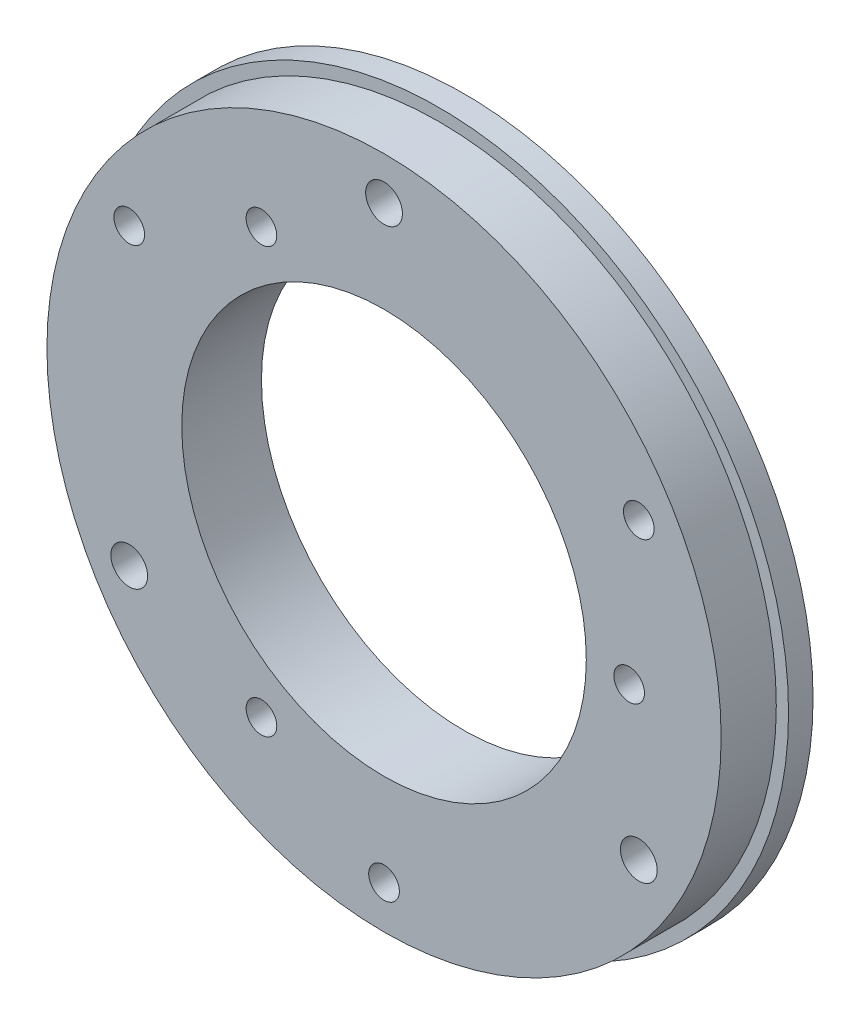
ISO-10303-21;
HEADER;
FILE_DESCRIPTION(('STEP AP214'),'2;1');
FILE_NAME('part.step','',(''),(''),'','','');
FILE_SCHEMA(('AUTOMOTIVE_DESIGN { 1 0 10303 214 1 1 1 1 }'));
ENDSEC;
DATA;
#1=APPLICATION_CONTEXT('core data for automotive mechanical design processes');
#2=APPLICATION_PROTOCOL_DEFINITION('international standard','automotive_design',2000,#1);
#3=PRODUCT_CONTEXT('',#1,'mechanical');
#4=PRODUCT('Part','Part','',(#3));
#5=PRODUCT_RELATED_PRODUCT_CATEGORY('part','',(#4));
#6=PRODUCT_DEFINITION_FORMATION('','',#4);
#7=PRODUCT_DEFINITION_CONTEXT('part definition',#1,'design');
#8=PRODUCT_DEFINITION('design','',#6,#7);
#9=PRODUCT_DEFINITION_SHAPE('','',#8);
#10=(LENGTH_UNIT() NAMED_UNIT(*) SI_UNIT(.MILLI.,.METRE.));
#11=(NAMED_UNIT(*) PLANE_ANGLE_UNIT() SI_UNIT($,.RADIAN.));
#12=(NAMED_UNIT(*) SI_UNIT($,.STERADIAN.) SOLID_ANGLE_UNIT());
#13=UNCERTAINTY_MEASURE_WITH_UNIT(LENGTH_MEASURE(1.E-05),#10,'distance_accuracy_value','');
#14=(GEOMETRIC_REPRESENTATION_CONTEXT(3) GLOBAL_UNCERTAINTY_ASSIGNED_CONTEXT((#13)) GLOBAL_UNIT_ASSIGNED_CONTEXT((#10,
#11,#12)) REPRESENTATION_CONTEXT('',''));
#15=CARTESIAN_POINT('',(0.,0.,0.));
#16=DIRECTION('',(0.,0.,1.));
#17=DIRECTION('',(1.,0.,0.));
#18=AXIS2_PLACEMENT_3D('',#15,#16,#17);
#19=CARTESIAN_POINT('',(0.,0.,2.));
#20=DIRECTION('',(0.,0.,1.));
#21=DIRECTION('',(1.,0.,0.));
#22=AXIS2_PLACEMENT_3D('',#19,#20,#21);
#23=PLANE('',#22);
#24=CARTESIAN_POINT('',(0.,0.,2.));
#25=DIRECTION('',(0.,0.,1.));
#26=DIRECTION('',(1.,0.,0.));
#27=AXIS2_PLACEMENT_3D('',#24,#25,#26);
#28=CIRCLE('',#27,27.5);
#29=CARTESIAN_POINT('',(27.5,0.,2.));
#30=VERTEX_POINT('',#29);
#31=EDGE_CURVE('E10',#30,#30,#28,.T.);
#32=ORIENTED_EDGE('',*,*,#31,.F.);
#33=EDGE_LOOP('',(#32));
#34=FACE_BOUND('',#33,.T.);
#35=CARTESIAN_POINT('',(0.,0.,2.));
#36=DIRECTION('',(0.,0.,1.));
#37=DIRECTION('',(1.,0.,0.));
#38=AXIS2_PLACEMENT_3D('',#35,#36,#37);
#39=CIRCLE('',#38,28.5);
#40=CARTESIAN_POINT('',(28.5,0.,2.));
#41=VERTEX_POINT('',#40);
#42=EDGE_CURVE('E42',#41,#41,#39,.T.);
#43=ORIENTED_EDGE('',*,*,#42,.T.);
#44=EDGE_LOOP('',(#43));
#45=FACE_BOUND('',#44,.T.);
#46=ADVANCED_FACE('F34',(#34,#45),#23,.T.);
#47=CARTESIAN_POINT('',(0.,0.,0.));
#48=DIRECTION('',(0.,0.,1.));
#49=DIRECTION('',(1.,0.,0.));
#50=AXIS2_PLACEMENT_3D('',#47,#48,#49);
#51=PLANE('',#50);
#52=CARTESIAN_POINT('',(-20.7846096908265,-12.0000000000001,0.));
#53=DIRECTION('',(0.,0.,-1.));
#54=DIRECTION('',(0.500000000000004,-0.866025403784436,0.));
#55=AXIS2_PLACEMENT_3D('',#52,#53,#54);
#56=CIRCLE('',#55,3.);
#57=CARTESIAN_POINT('',(-19.2846096908265,-14.5980762113534,0.));
#58=VERTEX_POINT('',#57);
#59=EDGE_CURVE('E326',#58,#58,#56,.T.);
#60=ORIENTED_EDGE('',*,*,#59,.F.);
#61=EDGE_LOOP('',(#60));
#62=FACE_BOUND('',#61,.T.);
#63=CARTESIAN_POINT('',(20.7846096908266,-11.9999999999998,0.));
#64=DIRECTION('',(0.,0.,-1.));
#65=DIRECTION('',(0.499999999999992,0.866025403784443,0.));
#66=AXIS2_PLACEMENT_3D('',#63,#64,#65);
#67=CIRCLE('',#66,3.);
#68=CARTESIAN_POINT('',(22.2846096908266,-9.40192378864648,0.));
#69=VERTEX_POINT('',#68);
#70=EDGE_CURVE('E319',#69,#69,#67,.T.);
#71=ORIENTED_EDGE('',*,*,#70,.F.);
#72=EDGE_LOOP('',(#71));
#73=FACE_BOUND('',#72,.T.);
#74=CARTESIAN_POINT('',(0.,24.,0.));
#75=DIRECTION('',(0.,0.,-1.));
#76=DIRECTION('',(-1.,0.,0.));
#77=AXIS2_PLACEMENT_3D('',#74,#75,#76);
#78=CIRCLE('',#77,3.);
#79=CARTESIAN_POINT('',(-3.,24.,0.));
#80=VERTEX_POINT('',#79);
#81=EDGE_CURVE('E74',#80,#80,#78,.T.);
#82=ORIENTED_EDGE('',*,*,#81,.F.);
#83=EDGE_LOOP('',(#82));
#84=FACE_BOUND('',#83,.T.);
#85=CARTESIAN_POINT('',(20.,-2.18575157973078E-13,0.));
#86=DIRECTION('',(0.,0.,-1.));
#87=DIRECTION('',(0.500000000000004,0.866025403784436,0.));
#88=AXIS2_PLACEMENT_3D('',#85,#86,#87);
#89=CIRCLE('',#88,1.25);
#90=CARTESIAN_POINT('',(20.625,1.08253175473033,0.));
#91=VERTEX_POINT('',#90);
#92=EDGE_CURVE('E61',#91,#91,#89,.T.);
#93=ORIENTED_EDGE('',*,*,#92,.F.);
#94=EDGE_LOOP('',(#93));
#95=FACE_BOUND('',#94,.T.);
#96=CARTESIAN_POINT('',(-10.0000000000003,-17.3205080756886,0.));
#97=DIRECTION('',(0.,0.,-1.));
#98=DIRECTION('',(0.499999999999992,-0.866025403784443,0.));
#99=AXIS2_PLACEMENT_3D('',#96,#97,#98);
#100=CIRCLE('',#99,1.25);
#101=CARTESIAN_POINT('',(-9.37500000000028,-18.4030398304192,0.));
#102=VERTEX_POINT('',#101);
#103=EDGE_CURVE('E66',#102,#102,#100,.T.);
#104=ORIENTED_EDGE('',*,*,#103,.F.);
#105=EDGE_LOOP('',(#104));
#106=FACE_BOUND('',#105,.T.);
#107=CARTESIAN_POINT('',(-9.99999999999989,17.3205080756888,0.));
#108=DIRECTION('',(0.,0.,-1.));
#109=DIRECTION('',(-1.,0.,0.));
#110=AXIS2_PLACEMENT_3D('',#107,#108,#109);
#111=CIRCLE('',#110,1.25);
#112=CARTESIAN_POINT('',(-11.2499999999999,17.3205080756888,0.));
#113=VERTEX_POINT('',#112);
#114=EDGE_CURVE('E58',#113,#113,#111,.T.);
#115=ORIENTED_EDGE('',*,*,#114,.F.);
#116=EDGE_LOOP('',(#115));
#117=FACE_BOUND('',#116,.T.);
#118=CARTESIAN_POINT('',(20.7846096908264,12.0000000000002,0.));
#119=DIRECTION('',(0.,0.,1.));
#120=DIRECTION('',(0.50000000000001,-0.866025403784433,0.));
#121=AXIS2_PLACEMENT_3D('',#118,#119,#120);
#122=CIRCLE('',#121,1.25);
#123=CARTESIAN_POINT('',(22.0346096908264,12.0000000000002,0.));
#124=VERTEX_POINT('',#123);
#125=EDGE_CURVE('E92',#124,#124,#122,.T.);
#126=ORIENTED_EDGE('',*,*,#125,.T.);
#127=EDGE_LOOP('',(#126));
#128=FACE_BOUND('',#127,.T.);
#129=CARTESIAN_POINT('',(0.,-24.,0.));
#130=DIRECTION('',(0.,0.,1.));
#131=DIRECTION('',(-1.,0.,0.));
#132=AXIS2_PLACEMENT_3D('',#129,#130,#131);
#133=CIRCLE('',#132,1.25);
#134=CARTESIAN_POINT('',(1.25,-24.,0.));
#135=VERTEX_POINT('',#134);
#136=EDGE_CURVE('E85',#135,#135,#133,.T.);
#137=ORIENTED_EDGE('',*,*,#136,.T.);
#138=EDGE_LOOP('',(#137));
#139=FACE_BOUND('',#138,.T.);
#140=CARTESIAN_POINT('',(-20.7846096908266,12.,0.));
#141=DIRECTION('',(0.,0.,1.));
#142=DIRECTION('',(0.499999999999998,0.86602540378444,0.));
#143=AXIS2_PLACEMENT_3D('',#140,#141,#142);
#144=CIRCLE('',#143,1.25);
#145=CARTESIAN_POINT('',(-19.5346096908266,12.,0.));
#146=VERTEX_POINT('',#145);
#147=EDGE_CURVE('E97',#146,#146,#144,.T.);
#148=ORIENTED_EDGE('',*,*,#147,.T.);
#149=EDGE_LOOP('',(#148));
#150=FACE_BOUND('',#149,.T.);
#151=CARTESIAN_POINT('',(0.,0.,0.));
#152=DIRECTION('',(0.,0.,1.));
#153=DIRECTION('',(1.,0.,0.));
#154=AXIS2_PLACEMENT_3D('',#151,#152,#153);
#155=CIRCLE('',#154,28.5);
#156=CARTESIAN_POINT('',(28.5,0.,0.));
#157=VERTEX_POINT('',#156);
#158=EDGE_CURVE('E47',#157,#157,#155,.T.);
#159=ORIENTED_EDGE('',*,*,#158,.F.);
#160=EDGE_LOOP('',(#159));
#161=FACE_BOUND('',#160,.T.);
#162=CARTESIAN_POINT('',(0.,0.,0.));
#163=DIRECTION('',(0.,0.,-1.));
#164=DIRECTION('',(-1.,0.,0.));
#165=AXIS2_PLACEMENT_3D('',#162,#163,#164);
#166=CIRCLE('',#165,16.5);
#167=CARTESIAN_POINT('',(-16.5,0.,0.));
#168=VERTEX_POINT('',#167);
#169=EDGE_CURVE('E57',#168,#168,#166,.T.);
#170=ORIENTED_EDGE('',*,*,#169,.F.);
#171=EDGE_LOOP('',(#170));
#172=FACE_BOUND('',#171,.T.);
#173=ADVANCED_FACE('F133',(#62,#73,#84,#95,#106,#117,#128,#139,#150,#161,#172),#51,.F.);
#174=CARTESIAN_POINT('',(0.,0.,2.));
#175=DIRECTION('',(0.,0.,-1.));
#176=DIRECTION('',(-1.,0.,0.));
#177=AXIS2_PLACEMENT_3D('',#174,#175,#176);
#178=CYLINDRICAL_SURFACE('',#177,28.5);
#179=ORIENTED_EDGE('',*,*,#42,.F.);
#180=EDGE_LOOP('',(#179));
#181=FACE_BOUND('',#180,.T.);
#182=ORIENTED_EDGE('',*,*,#158,.T.);
#183=EDGE_LOOP('',(#182));
#184=FACE_BOUND('',#183,.T.);
#185=ADVANCED_FACE('F36',(#181,#184),#178,.T.);
#186=CARTESIAN_POINT('',(0.,0.,6.5));
#187=DIRECTION('',(0.,0.,1.));
#188=DIRECTION('',(1.,0.,0.));
#189=AXIS2_PLACEMENT_3D('',#186,#187,#188);
#190=PLANE('',#189);
#191=CARTESIAN_POINT('',(0.,24.,6.5));
#192=DIRECTION('',(0.,0.,-1.));
#193=DIRECTION('',(-1.,0.,0.));
#194=AXIS2_PLACEMENT_3D('',#191,#192,#193);
#195=CIRCLE('',#194,1.5);
#196=CARTESIAN_POINT('',(-1.5,24.,6.5));
#197=VERTEX_POINT('',#196);
#198=EDGE_CURVE('E323',#197,#197,#195,.T.);
#199=ORIENTED_EDGE('',*,*,#198,.T.);
#200=EDGE_LOOP('',(#199));
#201=FACE_BOUND('',#200,.T.);
#202=CARTESIAN_POINT('',(-20.7846096908281,-11.9999999999991,6.5));
#203=DIRECTION('',(0.,0.,-1.));
#204=DIRECTION('',(-1.,0.,0.));
#205=AXIS2_PLACEMENT_3D('',#202,#203,#204);
#206=CIRCLE('',#205,1.50000000000132);
#207=CARTESIAN_POINT('',(-22.2846096908294,-11.9999999999991,6.5));
#208=VERTEX_POINT('',#207);
#209=EDGE_CURVE('E340',#208,#208,#206,.T.);
#210=ORIENTED_EDGE('',*,*,#209,.T.);
#211=EDGE_LOOP('',(#210));
#212=FACE_BOUND('',#211,.T.);
#213=CARTESIAN_POINT('',(20.784609690825,-12.0000000000009,6.5));
#214=DIRECTION('',(0.,0.,-1.));
#215=DIRECTION('',(-1.,0.,0.));
#216=AXIS2_PLACEMENT_3D('',#213,#214,#215);
#217=CIRCLE('',#216,1.50000000000194);
#218=CARTESIAN_POINT('',(19.2846096908231,-12.0000000000009,6.5));
#219=VERTEX_POINT('',#218);
#220=EDGE_CURVE('E334',#219,#219,#217,.T.);
#221=ORIENTED_EDGE('',*,*,#220,.T.);
#222=EDGE_LOOP('',(#221));
#223=FACE_BOUND('',#222,.T.);
#224=CARTESIAN_POINT('',(20.,-2.18575157973078E-13,6.5));
#225=DIRECTION('',(0.,0.,1.));
#226=DIRECTION('',(1.,0.,0.));
#227=AXIS2_PLACEMENT_3D('',#224,#225,#226);
#228=CIRCLE('',#227,1.25);
#229=CARTESIAN_POINT('',(21.25,-2.18575157973078E-13,6.5));
#230=VERTEX_POINT('',#229);
#231=EDGE_CURVE('E38',#230,#230,#228,.T.);
#232=ORIENTED_EDGE('',*,*,#231,.F.);
#233=EDGE_LOOP('',(#232));
#234=FACE_BOUND('',#233,.T.);
#235=CARTESIAN_POINT('',(-10.0000000000003,-17.3205080756886,6.5));
#236=DIRECTION('',(0.,0.,1.));
#237=DIRECTION('',(1.,0.,0.));
#238=AXIS2_PLACEMENT_3D('',#235,#236,#237);
#239=CIRCLE('',#238,1.25);
#240=CARTESIAN_POINT('',(-8.75000000000027,-17.3205080756886,6.5));
#241=VERTEX_POINT('',#240);
#242=EDGE_CURVE('E59',#241,#241,#239,.T.);
#243=ORIENTED_EDGE('',*,*,#242,.F.);
#244=EDGE_LOOP('',(#243));
#245=FACE_BOUND('',#244,.T.);
#246=CARTESIAN_POINT('',(-9.99999999999989,17.3205080756888,6.5));
#247=DIRECTION('',(0.,0.,1.));
#248=DIRECTION('',(1.,0.,0.));
#249=AXIS2_PLACEMENT_3D('',#246,#247,#248);
#250=CIRCLE('',#249,1.25);
#251=CARTESIAN_POINT('',(-8.74999999999989,17.3205080756888,6.5));
#252=VERTEX_POINT('',#251);
#253=EDGE_CURVE('E55',#252,#252,#250,.T.);
#254=ORIENTED_EDGE('',*,*,#253,.F.);
#255=EDGE_LOOP('',(#254));
#256=FACE_BOUND('',#255,.T.);
#257=CARTESIAN_POINT('',(20.7846096908264,12.0000000000002,6.5));
#258=DIRECTION('',(0.,0.,1.));
#259=DIRECTION('',(0.50000000000001,-0.866025403784433,0.));
#260=AXIS2_PLACEMENT_3D('',#257,#258,#259);
#261=CIRCLE('',#260,1.25);
#262=CARTESIAN_POINT('',(22.0346096908264,12.0000000000002,6.5));
#263=VERTEX_POINT('',#262);
#264=EDGE_CURVE('E84',#263,#263,#261,.T.);
#265=ORIENTED_EDGE('',*,*,#264,.F.);
#266=EDGE_LOOP('',(#265));
#267=FACE_BOUND('',#266,.T.);
#268=CARTESIAN_POINT('',(0.,-24.,6.5));
#269=DIRECTION('',(0.,0.,1.));
#270=DIRECTION('',(-1.,0.,0.));
#271=AXIS2_PLACEMENT_3D('',#268,#269,#270);
#272=CIRCLE('',#271,1.25);
#273=CARTESIAN_POINT('',(1.25,-24.,6.5));
#274=VERTEX_POINT('',#273);
#275=EDGE_CURVE('E89',#274,#274,#272,.T.);
#276=ORIENTED_EDGE('',*,*,#275,.F.);
#277=EDGE_LOOP('',(#276));
#278=FACE_BOUND('',#277,.T.);
#279=CARTESIAN_POINT('',(-20.7846096908266,12.,6.5));
#280=DIRECTION('',(0.,0.,1.));
#281=DIRECTION('',(0.499999999999998,0.86602540378444,0.));
#282=AXIS2_PLACEMENT_3D('',#279,#280,#281);
#283=CIRCLE('',#282,1.25);
#284=CARTESIAN_POINT('',(-19.5346096908266,12.,6.5));
#285=VERTEX_POINT('',#284);
#286=EDGE_CURVE('E88',#285,#285,#283,.T.);
#287=ORIENTED_EDGE('',*,*,#286,.F.);
#288=EDGE_LOOP('',(#287));
#289=FACE_BOUND('',#288,.T.);
#290=CARTESIAN_POINT('',(0.,0.,6.5));
#291=DIRECTION('',(0.,0.,1.));
#292=DIRECTION('',(1.,0.,0.));
#293=AXIS2_PLACEMENT_3D('',#290,#291,#292);
#294=CIRCLE('',#293,27.5);
#295=CARTESIAN_POINT('',(27.5,0.,6.5));
#296=VERTEX_POINT('',#295);
#297=EDGE_CURVE('E50',#296,#296,#294,.T.);
#298=ORIENTED_EDGE('',*,*,#297,.T.);
#299=EDGE_LOOP('',(#298));
#300=FACE_BOUND('',#299,.T.);
#301=CARTESIAN_POINT('',(0.,0.,6.5));
#302=DIRECTION('',(0.,0.,1.));
#303=DIRECTION('',(1.,0.,0.));
#304=AXIS2_PLACEMENT_3D('',#301,#302,#303);
#305=CIRCLE('',#304,16.5);
#306=CARTESIAN_POINT('',(16.5,0.,6.5));
#307=VERTEX_POINT('',#306);
#308=EDGE_CURVE('E81',#307,#307,#305,.F.);
#309=ORIENTED_EDGE('',*,*,#308,.T.);
#310=EDGE_LOOP('',(#309));
#311=FACE_BOUND('',#310,.T.);
#312=ADVANCED_FACE('F104',(#201,#212,#223,#234,#245,#256,#267,#278,#289,#300,#311),#190,.T.);
#313=CARTESIAN_POINT('',(0.,0.,6.5));
#314=DIRECTION('',(0.,0.,-1.));
#315=DIRECTION('',(-1.,0.,0.));
#316=AXIS2_PLACEMENT_3D('',#313,#314,#315);
#317=CYLINDRICAL_SURFACE('',#316,27.5);
#318=ORIENTED_EDGE('',*,*,#297,.F.);
#319=EDGE_LOOP('',(#318));
#320=FACE_BOUND('',#319,.T.);
#321=ORIENTED_EDGE('',*,*,#31,.T.);
#322=EDGE_LOOP('',(#321));
#323=FACE_BOUND('',#322,.T.);
#324=ADVANCED_FACE('F107',(#320,#323),#317,.T.);
#325=CARTESIAN_POINT('',(-20.7846096908266,12.,0.));
#326=DIRECTION('',(0.,0.,1.));
#327=DIRECTION('',(1.,0.,0.));
#328=AXIS2_PLACEMENT_3D('',#325,#326,#327);
#329=CYLINDRICAL_SURFACE('',#328,1.25);
#330=CARTESIAN_POINT('',(-19.5346096908266,12.,0.));
#331=CARTESIAN_POINT('',(-19.5346096908266,12.,0.0677083333333332));
#332=CARTESIAN_POINT('',(-19.5346096908266,12.,0.135416666666667));
#333=CARTESIAN_POINT('',(-19.5346096908266,12.,0.270833333333333));
#334=CARTESIAN_POINT('',(-19.5346096908266,12.,0.338541666666667));
#335=CARTESIAN_POINT('',(-19.5346096908266,12.,0.473958333333333));
#336=CARTESIAN_POINT('',(-19.5346096908266,12.,0.541666666666667));
#337=CARTESIAN_POINT('',(-19.5346096908266,12.,0.677083333333333));
#338=CARTESIAN_POINT('',(-19.5346096908266,12.,0.744791666666667));
#339=CARTESIAN_POINT('',(-19.5346096908266,12.,0.880208333333333));
#340=CARTESIAN_POINT('',(-19.5346096908266,12.,0.947916666666667));
#341=CARTESIAN_POINT('',(-19.5346096908266,12.,1.08333333333333));
#342=CARTESIAN_POINT('',(-19.5346096908266,12.,1.15104166666667));
#343=CARTESIAN_POINT('',(-19.5346096908266,12.,1.28645833333333));
#344=CARTESIAN_POINT('',(-19.5346096908266,12.,1.35416666666667));
#345=CARTESIAN_POINT('',(-19.5346096908266,12.,1.48958333333333));
#346=CARTESIAN_POINT('',(-19.5346096908266,12.,1.55729166666667));
#347=CARTESIAN_POINT('',(-19.5346096908266,12.,1.69270833333333));
#348=CARTESIAN_POINT('',(-19.5346096908266,12.,1.76041666666667));
#349=CARTESIAN_POINT('',(-19.5346096908266,12.,1.89583333333333));
#350=CARTESIAN_POINT('',(-19.5346096908266,12.,1.96354166666667));
#351=CARTESIAN_POINT('',(-19.5346096908266,12.,2.09895833333333));
#352=CARTESIAN_POINT('',(-19.5346096908266,12.,2.16666666666667));
#353=CARTESIAN_POINT('',(-19.5346096908266,12.,2.30208333333333));
#354=CARTESIAN_POINT('',(-19.5346096908266,12.,2.36979166666667));
#355=CARTESIAN_POINT('',(-19.5346096908266,12.,2.50520833333333));
#356=CARTESIAN_POINT('',(-19.5346096908266,12.,2.57291666666667));
#357=CARTESIAN_POINT('',(-19.5346096908266,12.,2.70833333333333));
#358=CARTESIAN_POINT('',(-19.5346096908266,12.,2.77604166666667));
#359=CARTESIAN_POINT('',(-19.5346096908266,12.,2.91145833333333));
#360=CARTESIAN_POINT('',(-19.5346096908266,12.,2.97916666666667));
#361=CARTESIAN_POINT('',(-19.5346096908266,12.,3.11458333333333));
#362=CARTESIAN_POINT('',(-19.5346096908266,12.,3.18229166666667));
#363=CARTESIAN_POINT('',(-19.5346096908266,12.,3.31770833333333));
#364=CARTESIAN_POINT('',(-19.5346096908266,12.,3.38541666666667));
#365=CARTESIAN_POINT('',(-19.5346096908266,12.,3.52083333333333));
#366=CARTESIAN_POINT('',(-19.5346096908266,12.,3.58854166666667));
#367=CARTESIAN_POINT('',(-19.5346096908266,12.,3.72395833333333));
#368=CARTESIAN_POINT('',(-19.5346096908266,12.,3.79166666666667));
#369=CARTESIAN_POINT('',(-19.5346096908266,12.,3.92708333333333));
#370=CARTESIAN_POINT('',(-19.5346096908266,12.,3.99479166666667));
#371=CARTESIAN_POINT('',(-19.5346096908266,12.,4.13020833333333));
#372=CARTESIAN_POINT('',(-19.5346096908266,12.,4.19791666666667));
#373=CARTESIAN_POINT('',(-19.5346096908266,12.,4.33333333333333));
#374=CARTESIAN_POINT('',(-19.5346096908266,12.,4.40104166666667));
#375=CARTESIAN_POINT('',(-19.5346096908266,12.,4.53645833333333));
#376=CARTESIAN_POINT('',(-19.5346096908266,12.,4.60416666666667));
#377=CARTESIAN_POINT('',(-19.5346096908266,12.,4.73958333333333));
#378=CARTESIAN_POINT('',(-19.5346096908266,12.,4.80729166666667));
#379=CARTESIAN_POINT('',(-19.5346096908266,12.,4.94270833333333));
#380=CARTESIAN_POINT('',(-19.5346096908266,12.,5.01041666666667));
#381=CARTESIAN_POINT('',(-19.5346096908266,12.,5.14583333333333));
#382=CARTESIAN_POINT('',(-19.5346096908266,12.,5.21354166666667));
#383=CARTESIAN_POINT('',(-19.5346096908266,12.,5.34895833333333));
#384=CARTESIAN_POINT('',(-19.5346096908266,12.,5.41666666666667));
#385=CARTESIAN_POINT('',(-19.5346096908266,12.,5.55208333333333));
#386=CARTESIAN_POINT('',(-19.5346096908266,12.,5.61979166666667));
#387=CARTESIAN_POINT('',(-19.5346096908266,12.,5.75520833333333));
#388=CARTESIAN_POINT('',(-19.5346096908266,12.,5.82291666666667));
#389=CARTESIAN_POINT('',(-19.5346096908266,12.,5.95833333333333));
#390=CARTESIAN_POINT('',(-19.5346096908266,12.,6.02604166666667));
#391=CARTESIAN_POINT('',(-19.5346096908266,12.,6.16145833333333));
#392=CARTESIAN_POINT('',(-19.5346096908266,12.,6.22916666666667));
#393=CARTESIAN_POINT('',(-19.5346096908266,12.,6.36458333333333));
#394=CARTESIAN_POINT('',(-19.5346096908266,12.,6.43229166666667));
#395=CARTESIAN_POINT('',(-19.5346096908266,12.,6.5));
#396=B_SPLINE_CURVE_WITH_KNOTS('',3,(#330,#331,#332,#333,#334,#335,#336,#337,#338,#339,#340,
#341,#342,#343,#344,#345,#346,#347,#348,#349,#350,#351,#352,#353,#354,#355,#356,#357,#358,#359,
#360,#361,#362,#363,#364,#365,#366,#367,#368,#369,#370,#371,#372,#373,#374,#375,#376,#377,#378,
#379,#380,#381,#382,#383,#384,#385,#386,#387,#388,#389,#390,#391,#392,#393,#394,#395),
.UNSPECIFIED.,.F.,.F.,(4,2,2,2,2,2,2,2,2,2,2,2,2,2,2,2,2,2,2,2,2,2,2,2,2,2,2,2,2,2,2,2,4),(0.,
0.203125,0.40625,0.609375,0.8125,1.015625,1.21875,1.421875,1.625,1.828125,2.03125,2.234375,
2.4375,2.640625,2.84375,3.046875,3.25,3.453125,3.65625,3.859375,4.0625,4.265625,4.46875,
4.671875,4.875,5.078125,5.28125,5.484375,5.6875,5.890625,6.09375,6.296875,6.5),.UNSPECIFIED.);
#397=EDGE_CURVE('BSEAM102',#146,#285,#396,.T.);
#398=ORIENTED_EDGE('',*,*,#147,.F.);
#399=ORIENTED_EDGE('',*,*,#286,.T.);
#400=ORIENTED_EDGE('',*,*,#397,.T.);
#401=ORIENTED_EDGE('',*,*,#397,.F.);
#402=EDGE_LOOP('',(#398,#400,#399,#401));
#403=FACE_BOUND('',#402,.T.);
#404=ADVANCED_FACE('F102',(#403),#329,.F.);
#405=CARTESIAN_POINT('',(0.,-24.,0.));
#406=DIRECTION('',(0.,0.,1.));
#407=DIRECTION('',(1.,0.,0.));
#408=AXIS2_PLACEMENT_3D('',#405,#406,#407);
#409=CYLINDRICAL_SURFACE('',#408,1.25);
#410=CARTESIAN_POINT('',(1.25,-24.,0.));
#411=CARTESIAN_POINT('',(1.25,-24.,0.0677083333333332));
#412=CARTESIAN_POINT('',(1.25,-24.,0.135416666666667));
#413=CARTESIAN_POINT('',(1.25,-24.,0.270833333333333));
#414=CARTESIAN_POINT('',(1.25,-24.,0.338541666666667));
#415=CARTESIAN_POINT('',(1.25,-24.,0.473958333333333));
#416=CARTESIAN_POINT('',(1.25,-24.,0.541666666666667));
#417=CARTESIAN_POINT('',(1.25,-24.,0.677083333333333));
#418=CARTESIAN_POINT('',(1.25,-24.,0.744791666666667));
#419=CARTESIAN_POINT('',(1.25,-24.,0.880208333333333));
#420=CARTESIAN_POINT('',(1.25,-24.,0.947916666666667));
#421=CARTESIAN_POINT('',(1.25,-24.,1.08333333333333));
#422=CARTESIAN_POINT('',(1.25,-24.,1.15104166666667));
#423=CARTESIAN_POINT('',(1.25,-24.,1.28645833333333));
#424=CARTESIAN_POINT('',(1.25,-24.,1.35416666666667));
#425=CARTESIAN_POINT('',(1.25,-24.,1.48958333333333));
#426=CARTESIAN_POINT('',(1.25,-24.,1.55729166666667));
#427=CARTESIAN_POINT('',(1.25,-24.,1.69270833333333));
#428=CARTESIAN_POINT('',(1.25,-24.,1.76041666666667));
#429=CARTESIAN_POINT('',(1.25,-24.,1.89583333333333));
#430=CARTESIAN_POINT('',(1.25,-24.,1.96354166666667));
#431=CARTESIAN_POINT('',(1.25,-24.,2.09895833333333));
#432=CARTESIAN_POINT('',(1.25,-24.,2.16666666666667));
#433=CARTESIAN_POINT('',(1.25,-24.,2.30208333333333));
#434=CARTESIAN_POINT('',(1.25,-24.,2.36979166666667));
#435=CARTESIAN_POINT('',(1.25,-24.,2.50520833333333));
#436=CARTESIAN_POINT('',(1.25,-24.,2.57291666666667));
#437=CARTESIAN_POINT('',(1.25,-24.,2.70833333333333));
#438=CARTESIAN_POINT('',(1.25,-24.,2.77604166666667));
#439=CARTESIAN_POINT('',(1.25,-24.,2.91145833333333));
#440=CARTESIAN_POINT('',(1.25,-24.,2.97916666666667));
#441=CARTESIAN_POINT('',(1.25,-24.,3.11458333333333));
#442=CARTESIAN_POINT('',(1.25,-24.,3.18229166666667));
#443=CARTESIAN_POINT('',(1.25,-24.,3.31770833333333));
#444=CARTESIAN_POINT('',(1.25,-24.,3.38541666666667));
#445=CARTESIAN_POINT('',(1.25,-24.,3.52083333333333));
#446=CARTESIAN_POINT('',(1.25,-24.,3.58854166666667));
#447=CARTESIAN_POINT('',(1.25,-24.,3.72395833333333));
#448=CARTESIAN_POINT('',(1.25,-24.,3.79166666666667));
#449=CARTESIAN_POINT('',(1.25,-24.,3.92708333333333));
#450=CARTESIAN_POINT('',(1.25,-24.,3.99479166666667));
#451=CARTESIAN_POINT('',(1.25,-24.,4.13020833333333));
#452=CARTESIAN_POINT('',(1.25,-24.,4.19791666666667));
#453=CARTESIAN_POINT('',(1.25,-24.,4.33333333333333));
#454=CARTESIAN_POINT('',(1.25,-24.,4.40104166666667));
#455=CARTESIAN_POINT('',(1.25,-24.,4.53645833333333));
#456=CARTESIAN_POINT('',(1.25,-24.,4.60416666666667));
#457=CARTESIAN_POINT('',(1.25,-24.,4.73958333333333));
#458=CARTESIAN_POINT('',(1.25,-24.,4.80729166666667));
#459=CARTESIAN_POINT('',(1.25,-24.,4.94270833333333));
#460=CARTESIAN_POINT('',(1.25,-24.,5.01041666666667));
#461=CARTESIAN_POINT('',(1.25,-24.,5.14583333333333));
#462=CARTESIAN_POINT('',(1.25,-24.,5.21354166666667));
#463=CARTESIAN_POINT('',(1.25,-24.,5.34895833333333));
#464=CARTESIAN_POINT('',(1.25,-24.,5.41666666666667));
#465=CARTESIAN_POINT('',(1.25,-24.,5.55208333333333));
#466=CARTESIAN_POINT('',(1.25,-24.,5.61979166666667));
#467=CARTESIAN_POINT('',(1.25,-24.,5.75520833333333));
#468=CARTESIAN_POINT('',(1.25,-24.,5.82291666666667));
#469=CARTESIAN_POINT('',(1.25,-24.,5.95833333333333));
#470=CARTESIAN_POINT('',(1.25,-24.,6.02604166666667));
#471=CARTESIAN_POINT('',(1.25,-24.,6.16145833333333));
#472=CARTESIAN_POINT('',(1.25,-24.,6.22916666666667));
#473=CARTESIAN_POINT('',(1.25,-24.,6.36458333333333));
#474=CARTESIAN_POINT('',(1.25,-24.,6.43229166666667));
#475=CARTESIAN_POINT('',(1.25,-24.,6.5));
#476=B_SPLINE_CURVE_WITH_KNOTS('',3,(#410,#411,#412,#413,#414,#415,#416,#417,#418,#419,#420,
#421,#422,#423,#424,#425,#426,#427,#428,#429,#430,#431,#432,#433,#434,#435,#436,#437,#438,#439,
#440,#441,#442,#443,#444,#445,#446,#447,#448,#449,#450,#451,#452,#453,#454,#455,#456,#457,#458,
#459,#460,#461,#462,#463,#464,#465,#466,#467,#468,#469,#470,#471,#472,#473,#474,#475),
.UNSPECIFIED.,.F.,.F.,(4,2,2,2,2,2,2,2,2,2,2,2,2,2,2,2,2,2,2,2,2,2,2,2,2,2,2,2,2,2,2,2,4),(0.,
0.203125,0.40625,0.609375,0.8125,1.015625,1.21875,1.421875,1.625,1.828125,2.03125,2.234375,
2.4375,2.640625,2.84375,3.046875,3.25,3.453125,3.65625,3.859375,4.0625,4.265625,4.46875,
4.671875,4.875,5.078125,5.28125,5.484375,5.6875,5.890625,6.09375,6.296875,6.5),.UNSPECIFIED.);
#477=EDGE_CURVE('BSEAM128',#135,#274,#476,.T.);
#478=ORIENTED_EDGE('',*,*,#136,.F.);
#479=ORIENTED_EDGE('',*,*,#275,.T.);
#480=ORIENTED_EDGE('',*,*,#477,.T.);
#481=ORIENTED_EDGE('',*,*,#477,.F.);
#482=EDGE_LOOP('',(#478,#480,#479,#481));
#483=FACE_BOUND('',#482,.T.);
#484=ADVANCED_FACE('F128',(#483),#409,.F.);
#485=CARTESIAN_POINT('',(20.7846096908264,12.0000000000002,0.));
#486=DIRECTION('',(0.,0.,1.));
#487=DIRECTION('',(1.,0.,0.));
#488=AXIS2_PLACEMENT_3D('',#485,#486,#487);
#489=CYLINDRICAL_SURFACE('',#488,1.25);
#490=CARTESIAN_POINT('',(22.0346096908264,12.0000000000002,0.));
#491=CARTESIAN_POINT('',(22.0346096908264,12.0000000000002,0.0677083333333332));
#492=CARTESIAN_POINT('',(22.0346096908264,12.0000000000002,0.135416666666667));
#493=CARTESIAN_POINT('',(22.0346096908264,12.0000000000002,0.270833333333333));
#494=CARTESIAN_POINT('',(22.0346096908264,12.0000000000002,0.338541666666667));
#495=CARTESIAN_POINT('',(22.0346096908264,12.0000000000002,0.473958333333333));
#496=CARTESIAN_POINT('',(22.0346096908264,12.0000000000002,0.541666666666667));
#497=CARTESIAN_POINT('',(22.0346096908264,12.0000000000002,0.677083333333333));
#498=CARTESIAN_POINT('',(22.0346096908264,12.0000000000002,0.744791666666667));
#499=CARTESIAN_POINT('',(22.0346096908264,12.0000000000002,0.880208333333333));
#500=CARTESIAN_POINT('',(22.0346096908264,12.0000000000002,0.947916666666667));
#501=CARTESIAN_POINT('',(22.0346096908264,12.0000000000002,1.08333333333333));
#502=CARTESIAN_POINT('',(22.0346096908264,12.0000000000002,1.15104166666667));
#503=CARTESIAN_POINT('',(22.0346096908264,12.0000000000002,1.28645833333333));
#504=CARTESIAN_POINT('',(22.0346096908264,12.0000000000002,1.35416666666667));
#505=CARTESIAN_POINT('',(22.0346096908264,12.0000000000002,1.48958333333333));
#506=CARTESIAN_POINT('',(22.0346096908264,12.0000000000002,1.55729166666667));
#507=CARTESIAN_POINT('',(22.0346096908264,12.0000000000002,1.69270833333333));
#508=CARTESIAN_POINT('',(22.0346096908264,12.0000000000002,1.76041666666667));
#509=CARTESIAN_POINT('',(22.0346096908264,12.0000000000002,1.89583333333333));
#510=CARTESIAN_POINT('',(22.0346096908264,12.0000000000002,1.96354166666667));
#511=CARTESIAN_POINT('',(22.0346096908264,12.0000000000002,2.09895833333333));
#512=CARTESIAN_POINT('',(22.0346096908264,12.0000000000002,2.16666666666667));
#513=CARTESIAN_POINT('',(22.0346096908264,12.0000000000002,2.30208333333333));
#514=CARTESIAN_POINT('',(22.0346096908264,12.0000000000002,2.36979166666667));
#515=CARTESIAN_POINT('',(22.0346096908264,12.0000000000002,2.50520833333333));
#516=CARTESIAN_POINT('',(22.0346096908264,12.0000000000002,2.57291666666667));
#517=CARTESIAN_POINT('',(22.0346096908264,12.0000000000002,2.70833333333333));
#518=CARTESIAN_POINT('',(22.0346096908264,12.0000000000002,2.77604166666667));
#519=CARTESIAN_POINT('',(22.0346096908264,12.0000000000002,2.91145833333333));
#520=CARTESIAN_POINT('',(22.0346096908264,12.0000000000002,2.97916666666667));
#521=CARTESIAN_POINT('',(22.0346096908264,12.0000000000002,3.11458333333333));
#522=CARTESIAN_POINT('',(22.0346096908264,12.0000000000002,3.18229166666667));
#523=CARTESIAN_POINT('',(22.0346096908264,12.0000000000002,3.31770833333333));
#524=CARTESIAN_POINT('',(22.0346096908264,12.0000000000002,3.38541666666667));
#525=CARTESIAN_POINT('',(22.0346096908264,12.0000000000002,3.52083333333333));
#526=CARTESIAN_POINT('',(22.0346096908264,12.0000000000002,3.58854166666667));
#527=CARTESIAN_POINT('',(22.0346096908264,12.0000000000002,3.72395833333333));
#528=CARTESIAN_POINT('',(22.0346096908264,12.0000000000002,3.79166666666667));
#529=CARTESIAN_POINT('',(22.0346096908264,12.0000000000002,3.92708333333333));
#530=CARTESIAN_POINT('',(22.0346096908264,12.0000000000002,3.99479166666667));
#531=CARTESIAN_POINT('',(22.0346096908264,12.0000000000002,4.13020833333333));
#532=CARTESIAN_POINT('',(22.0346096908264,12.0000000000002,4.19791666666667));
#533=CARTESIAN_POINT('',(22.0346096908264,12.0000000000002,4.33333333333333));
#534=CARTESIAN_POINT('',(22.0346096908264,12.0000000000002,4.40104166666667));
#535=CARTESIAN_POINT('',(22.0346096908264,12.0000000000002,4.53645833333333));
#536=CARTESIAN_POINT('',(22.0346096908264,12.0000000000002,4.60416666666667));
#537=CARTESIAN_POINT('',(22.0346096908264,12.0000000000002,4.73958333333333));
#538=CARTESIAN_POINT('',(22.0346096908264,12.0000000000002,4.80729166666667));
#539=CARTESIAN_POINT('',(22.0346096908264,12.0000000000002,4.94270833333333));
#540=CARTESIAN_POINT('',(22.0346096908264,12.0000000000002,5.01041666666667));
#541=CARTESIAN_POINT('',(22.0346096908264,12.0000000000002,5.14583333333333));
#542=CARTESIAN_POINT('',(22.0346096908264,12.0000000000002,5.21354166666667));
#543=CARTESIAN_POINT('',(22.0346096908264,12.0000000000002,5.34895833333333));
#544=CARTESIAN_POINT('',(22.0346096908264,12.0000000000002,5.41666666666667));
#545=CARTESIAN_POINT('',(22.0346096908264,12.0000000000002,5.55208333333333));
#546=CARTESIAN_POINT('',(22.0346096908264,12.0000000000002,5.61979166666667));
#547=CARTESIAN_POINT('',(22.0346096908264,12.0000000000002,5.75520833333333));
#548=CARTESIAN_POINT('',(22.0346096908264,12.0000000000002,5.82291666666667));
#549=CARTESIAN_POINT('',(22.0346096908264,12.0000000000002,5.95833333333333));
#550=CARTESIAN_POINT('',(22.0346096908264,12.0000000000002,6.02604166666667));
#551=CARTESIAN_POINT('',(22.0346096908264,12.0000000000002,6.16145833333333));
#552=CARTESIAN_POINT('',(22.0346096908264,12.0000000000002,6.22916666666667));
#553=CARTESIAN_POINT('',(22.0346096908264,12.0000000000002,6.36458333333333));
#554=CARTESIAN_POINT('',(22.0346096908264,12.0000000000002,6.43229166666667));
#555=CARTESIAN_POINT('',(22.0346096908264,12.0000000000002,6.5));
#556=B_SPLINE_CURVE_WITH_KNOTS('',3,(#490,#491,#492,#493,#494,#495,#496,#497,#498,#499,#500,
#501,#502,#503,#504,#505,#506,#507,#508,#509,#510,#511,#512,#513,#514,#515,#516,#517,#518,#519,
#520,#521,#522,#523,#524,#525,#526,#527,#528,#529,#530,#531,#532,#533,#534,#535,#536,#537,#538,
#539,#540,#541,#542,#543,#544,#545,#546,#547,#548,#549,#550,#551,#552,#553,#554,#555),
.UNSPECIFIED.,.F.,.F.,(4,2,2,2,2,2,2,2,2,2,2,2,2,2,2,2,2,2,2,2,2,2,2,2,2,2,2,2,2,2,2,2,4),(0.,
0.203125,0.40625,0.609375,0.8125,1.015625,1.21875,1.421875,1.625,1.828125,2.03125,2.234375,
2.4375,2.640625,2.84375,3.046875,3.25,3.453125,3.65625,3.859375,4.0625,4.265625,4.46875,
4.671875,4.875,5.078125,5.28125,5.484375,5.6875,5.890625,6.09375,6.296875,6.5),.UNSPECIFIED.);
#557=EDGE_CURVE('BSEAM118',#124,#263,#556,.T.);
#558=ORIENTED_EDGE('',*,*,#125,.F.);
#559=ORIENTED_EDGE('',*,*,#264,.T.);
#560=ORIENTED_EDGE('',*,*,#557,.T.);
#561=ORIENTED_EDGE('',*,*,#557,.F.);
#562=EDGE_LOOP('',(#558,#560,#559,#561));
#563=FACE_BOUND('',#562,.T.);
#564=ADVANCED_FACE('F118',(#563),#489,.F.);
#565=CARTESIAN_POINT('',(0.,0.,61.6543289325507));
#566=DIRECTION('',(0.,0.,-1.));
#567=DIRECTION('',(-1.,0.,0.));
#568=AXIS2_PLACEMENT_3D('',#565,#566,#567);
#569=CYLINDRICAL_SURFACE('',#568,16.5);
#570=ORIENTED_EDGE('',*,*,#169,.T.);
#571=EDGE_LOOP('',(#570));
#572=FACE_BOUND('',#571,.T.);
#573=ORIENTED_EDGE('',*,*,#308,.F.);
#574=EDGE_LOOP('',(#573));
#575=FACE_BOUND('',#574,.T.);
#576=ADVANCED_FACE('F115',(#572,#575),#569,.F.);
#577=CARTESIAN_POINT('',(-9.99999999999989,17.3205080756888,10.));
#578=DIRECTION('',(0.,0.,-1.));
#579=DIRECTION('',(-1.,0.,0.));
#580=AXIS2_PLACEMENT_3D('',#577,#578,#579);
#581=CYLINDRICAL_SURFACE('',#580,1.25);
#582=ORIENTED_EDGE('',*,*,#253,.T.);
#583=EDGE_LOOP('',(#582));
#584=FACE_BOUND('',#583,.T.);
#585=ORIENTED_EDGE('',*,*,#114,.T.);
#586=EDGE_LOOP('',(#585));
#587=FACE_BOUND('',#586,.T.);
#588=ADVANCED_FACE('F117',(#584,#587),#581,.F.);
#589=CARTESIAN_POINT('',(-10.0000000000003,-17.3205080756886,10.));
#590=DIRECTION('',(0.,0.,-1.));
#591=DIRECTION('',(-1.,0.,0.));
#592=AXIS2_PLACEMENT_3D('',#589,#590,#591);
#593=CYLINDRICAL_SURFACE('',#592,1.25);
#594=ORIENTED_EDGE('',*,*,#242,.T.);
#595=EDGE_LOOP('',(#594));
#596=FACE_BOUND('',#595,.T.);
#597=ORIENTED_EDGE('',*,*,#103,.T.);
#598=EDGE_LOOP('',(#597));
#599=FACE_BOUND('',#598,.T.);
#600=ADVANCED_FACE('F125',(#596,#599),#593,.F.);
#601=CARTESIAN_POINT('',(20.,-2.18575157973078E-13,10.));
#602=DIRECTION('',(0.,0.,-1.));
#603=DIRECTION('',(-1.,0.,0.));
#604=AXIS2_PLACEMENT_3D('',#601,#602,#603);
#605=CYLINDRICAL_SURFACE('',#604,1.25);
#606=ORIENTED_EDGE('',*,*,#231,.T.);
#607=EDGE_LOOP('',(#606));
#608=FACE_BOUND('',#607,.T.);
#609=ORIENTED_EDGE('',*,*,#92,.T.);
#610=EDGE_LOOP('',(#609));
#611=FACE_BOUND('',#610,.T.);
#612=ADVANCED_FACE('F214',(#608,#611),#605,.F.);
#613=CARTESIAN_POINT('',(0.,24.,3.5));
#614=DIRECTION('',(0.,0.,-1.));
#615=DIRECTION('',(-1.,0.,0.));
#616=AXIS2_PLACEMENT_3D('',#613,#614,#615);
#617=PLANE('',#616);
#618=CARTESIAN_POINT('',(0.,24.,3.5));
#619=DIRECTION('',(0.,0.,-1.));
#620=DIRECTION('',(-1.,0.,0.));
#621=AXIS2_PLACEMENT_3D('',#618,#619,#620);
#622=CIRCLE('',#621,1.5);
#623=CARTESIAN_POINT('',(-1.5,24.,3.5));
#624=VERTEX_POINT('',#623);
#625=EDGE_CURVE('E313',#624,#624,#622,.T.);
#626=ORIENTED_EDGE('',*,*,#625,.F.);
#627=EDGE_LOOP('',(#626));
#628=FACE_BOUND('',#627,.T.);
#629=CARTESIAN_POINT('',(0.,24.,3.5));
#630=DIRECTION('',(0.,0.,-1.));
#631=DIRECTION('',(-1.,0.,0.));
#632=AXIS2_PLACEMENT_3D('',#629,#630,#631);
#633=CIRCLE('',#632,3.);
#634=CARTESIAN_POINT('',(-3.,24.,3.5));
#635=VERTEX_POINT('',#634);
#636=EDGE_CURVE('E71',#635,#635,#633,.T.);
#637=ORIENTED_EDGE('',*,*,#636,.T.);
#638=EDGE_LOOP('',(#637));
#639=FACE_BOUND('',#638,.T.);
#640=ADVANCED_FACE('F223',(#628,#639),#617,.T.);
#641=CARTESIAN_POINT('',(0.,24.,3.5));
#642=DIRECTION('',(0.,0.,-1.));
#643=DIRECTION('',(-1.,0.,0.));
#644=AXIS2_PLACEMENT_3D('',#641,#642,#643);
#645=CYLINDRICAL_SURFACE('',#644,3.);
#646=ORIENTED_EDGE('',*,*,#636,.F.);
#647=EDGE_LOOP('',(#646));
#648=FACE_BOUND('',#647,.T.);
#649=ORIENTED_EDGE('',*,*,#81,.T.);
#650=EDGE_LOOP('',(#649));
#651=FACE_BOUND('',#650,.T.);
#652=ADVANCED_FACE('F231',(#648,#651),#645,.F.);
#653=CARTESIAN_POINT('',(20.7846096908266,-11.9999999999998,3.5));
#654=DIRECTION('',(0.,0.,-1.));
#655=DIRECTION('',(0.499999999999992,0.866025403784443,0.));
#656=AXIS2_PLACEMENT_3D('',#653,#654,#655);
#657=PLANE('',#656);
#658=CARTESIAN_POINT('',(20.784609690825,-12.0000000000009,3.5));
#659=DIRECTION('',(0.,0.,-1.));
#660=DIRECTION('',(-1.,0.,0.));
#661=AXIS2_PLACEMENT_3D('',#658,#659,#660);
#662=CIRCLE('',#661,1.50000000000194);
#663=CARTESIAN_POINT('',(19.2846096908231,-12.0000000000009,3.5));
#664=VERTEX_POINT('',#663);
#665=EDGE_CURVE('E331',#664,#664,#662,.T.);
#666=ORIENTED_EDGE('',*,*,#665,.F.);
#667=EDGE_LOOP('',(#666));
#668=FACE_BOUND('',#667,.T.);
#669=CARTESIAN_POINT('',(20.7846096908266,-11.9999999999998,3.5));
#670=DIRECTION('',(0.,0.,-1.));
#671=DIRECTION('',(0.499999999999992,0.866025403784443,0.));
#672=AXIS2_PLACEMENT_3D('',#669,#670,#671);
#673=CIRCLE('',#672,3.);
#674=CARTESIAN_POINT('',(22.2846096908266,-9.40192378864648,3.5));
#675=VERTEX_POINT('',#674);
#676=EDGE_CURVE('E322',#675,#675,#673,.T.);
#677=ORIENTED_EDGE('',*,*,#676,.T.);
#678=EDGE_LOOP('',(#677));
#679=FACE_BOUND('',#678,.T.);
#680=ADVANCED_FACE('F235',(#668,#679),#657,.T.);
#681=CARTESIAN_POINT('',(20.7846096908266,-11.9999999999998,3.5));
#682=DIRECTION('',(0.,0.,-1.));
#683=DIRECTION('',(-1.,0.,0.));
#684=AXIS2_PLACEMENT_3D('',#681,#682,#683);
#685=CYLINDRICAL_SURFACE('',#684,3.);
#686=ORIENTED_EDGE('',*,*,#676,.F.);
#687=EDGE_LOOP('',(#686));
#688=FACE_BOUND('',#687,.T.);
#689=ORIENTED_EDGE('',*,*,#70,.T.);
#690=EDGE_LOOP('',(#689));
#691=FACE_BOUND('',#690,.T.);
#692=ADVANCED_FACE('F248',(#688,#691),#685,.F.);
#693=CARTESIAN_POINT('',(-20.7846096908265,-12.0000000000001,3.5));
#694=DIRECTION('',(0.,0.,-1.));
#695=DIRECTION('',(0.500000000000004,-0.866025403784436,0.));
#696=AXIS2_PLACEMENT_3D('',#693,#694,#695);
#697=PLANE('',#696);
#698=CARTESIAN_POINT('',(-20.7846096908281,-11.9999999999991,3.5));
#699=DIRECTION('',(0.,0.,-1.));
#700=DIRECTION('',(-1.,0.,0.));
#701=AXIS2_PLACEMENT_3D('',#698,#699,#700);
#702=CIRCLE('',#701,1.50000000000132);
#703=CARTESIAN_POINT('',(-22.2846096908294,-11.9999999999991,3.5));
#704=VERTEX_POINT('',#703);
#705=EDGE_CURVE('E337',#704,#704,#702,.T.);
#706=ORIENTED_EDGE('',*,*,#705,.F.);
#707=EDGE_LOOP('',(#706));
#708=FACE_BOUND('',#707,.T.);
#709=CARTESIAN_POINT('',(-20.7846096908265,-12.0000000000001,3.5));
#710=DIRECTION('',(0.,0.,-1.));
#711=DIRECTION('',(0.500000000000004,-0.866025403784436,0.));
#712=AXIS2_PLACEMENT_3D('',#709,#710,#711);
#713=CIRCLE('',#712,3.);
#714=CARTESIAN_POINT('',(-19.2846096908265,-14.5980762113534,3.5));
#715=VERTEX_POINT('',#714);
#716=EDGE_CURVE('E317',#715,#715,#713,.T.);
#717=ORIENTED_EDGE('',*,*,#716,.T.);
#718=EDGE_LOOP('',(#717));
#719=FACE_BOUND('',#718,.T.);
#720=ADVANCED_FACE('F252',(#708,#719),#697,.T.);
#721=CARTESIAN_POINT('',(-20.7846096908265,-12.0000000000001,3.5));
#722=DIRECTION('',(0.,0.,-1.));
#723=DIRECTION('',(-1.,0.,0.));
#724=AXIS2_PLACEMENT_3D('',#721,#722,#723);
#725=CYLINDRICAL_SURFACE('',#724,3.);
#726=ORIENTED_EDGE('',*,*,#716,.F.);
#727=EDGE_LOOP('',(#726));
#728=FACE_BOUND('',#727,.T.);
#729=ORIENTED_EDGE('',*,*,#59,.T.);
#730=EDGE_LOOP('',(#729));
#731=FACE_BOUND('',#730,.T.);
#732=ADVANCED_FACE('F260',(#728,#731),#725,.F.);
#733=CARTESIAN_POINT('',(-20.7846096908281,-11.9999999999991,6.5));
#734=DIRECTION('',(0.,0.,-1.));
#735=DIRECTION('',(-1.,0.,0.));
#736=AXIS2_PLACEMENT_3D('',#733,#734,#735);
#737=CYLINDRICAL_SURFACE('',#736,1.50000000000132);
#738=ORIENTED_EDGE('',*,*,#209,.F.);
#739=EDGE_LOOP('',(#738));
#740=FACE_BOUND('',#739,.T.);
#741=ORIENTED_EDGE('',*,*,#705,.T.);
#742=EDGE_LOOP('',(#741));
#743=FACE_BOUND('',#742,.T.);
#744=ADVANCED_FACE('F264',(#740,#743),#737,.F.);
#745=CARTESIAN_POINT('',(20.784609690825,-12.0000000000009,6.5));
#746=DIRECTION('',(0.,0.,-1.));
#747=DIRECTION('',(-1.,0.,0.));
#748=AXIS2_PLACEMENT_3D('',#745,#746,#747);
#749=CYLINDRICAL_SURFACE('',#748,1.50000000000194);
#750=ORIENTED_EDGE('',*,*,#220,.F.);
#751=EDGE_LOOP('',(#750));
#752=FACE_BOUND('',#751,.T.);
#753=ORIENTED_EDGE('',*,*,#665,.T.);
#754=EDGE_LOOP('',(#753));
#755=FACE_BOUND('',#754,.T.);
#756=ADVANCED_FACE('F277',(#752,#755),#749,.F.);
#757=CARTESIAN_POINT('',(0.,24.,6.5));
#758=DIRECTION('',(0.,0.,-1.));
#759=DIRECTION('',(-1.,0.,0.));
#760=AXIS2_PLACEMENT_3D('',#757,#758,#759);
#761=CYLINDRICAL_SURFACE('',#760,1.5);
#762=ORIENTED_EDGE('',*,*,#198,.F.);
#763=EDGE_LOOP('',(#762));
#764=FACE_BOUND('',#763,.T.);
#765=ORIENTED_EDGE('',*,*,#625,.T.);
#766=EDGE_LOOP('',(#765));
#767=FACE_BOUND('',#766,.T.);
#768=ADVANCED_FACE('F284',(#764,#767),#761,.F.);
#769=CLOSED_SHELL('',(#46,#173,#185,#312,#324,#404,#484,#564,#576,#588,#600,#612,#640,#652,#680,
#692,#720,#732,#744,#756,#768));
#770=MANIFOLD_SOLID_BREP('B2',#769);
#771=ADVANCED_BREP_SHAPE_REPRESENTATION('',(#18,#770),#14);
#772=SHAPE_DEFINITION_REPRESENTATION(#9,#771);
ENDSEC;
END-ISO-10303-21;
